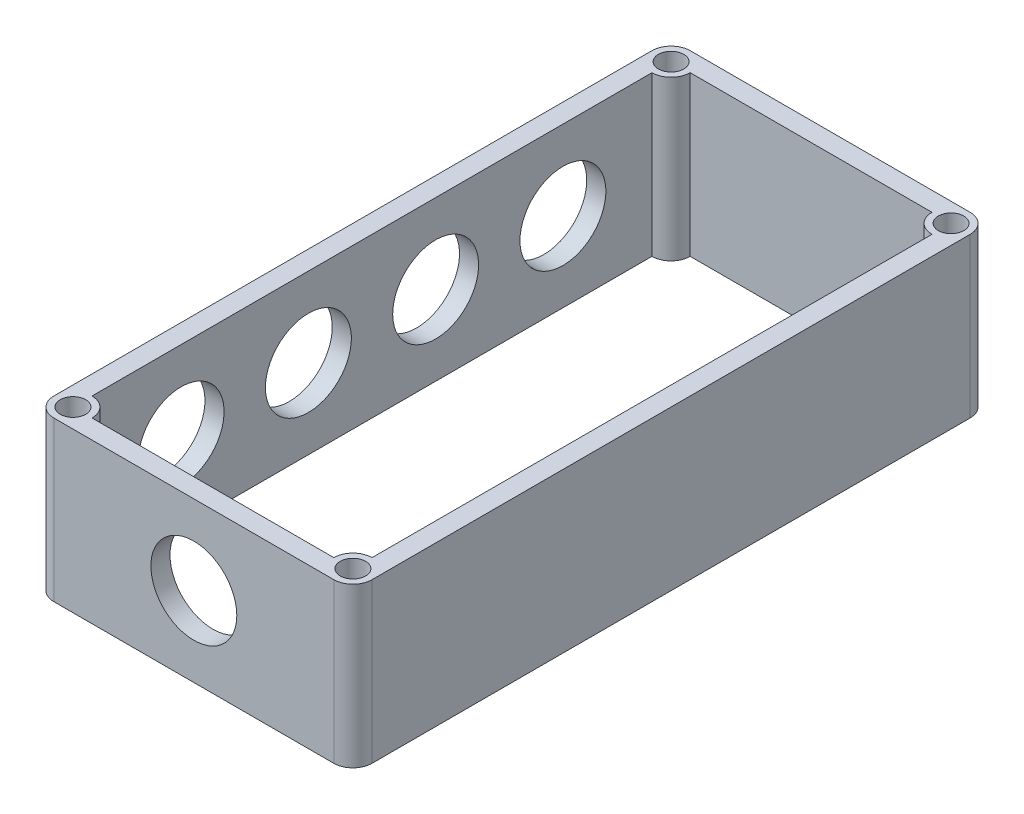
ISO-10303-21;
HEADER;
FILE_DESCRIPTION(('STEP AP214'),'2;1');
FILE_NAME('part.step','',(''),(''),'','','');
FILE_SCHEMA(('AUTOMOTIVE_DESIGN { 1 0 10303 214 1 1 1 1 }'));
ENDSEC;
DATA;
#1=APPLICATION_CONTEXT('core data for automotive mechanical design processes');
#2=APPLICATION_PROTOCOL_DEFINITION('international standard','automotive_design',2000,#1);
#3=PRODUCT_CONTEXT('',#1,'mechanical');
#4=PRODUCT('Part','Part','',(#3));
#5=PRODUCT_RELATED_PRODUCT_CATEGORY('part','',(#4));
#6=PRODUCT_DEFINITION_FORMATION('','',#4);
#7=PRODUCT_DEFINITION_CONTEXT('part definition',#1,'design');
#8=PRODUCT_DEFINITION('design','',#6,#7);
#9=PRODUCT_DEFINITION_SHAPE('','',#8);
#10=(LENGTH_UNIT() NAMED_UNIT(*) SI_UNIT(.MILLI.,.METRE.));
#11=(NAMED_UNIT(*) PLANE_ANGLE_UNIT() SI_UNIT($,.RADIAN.));
#12=(NAMED_UNIT(*) SI_UNIT($,.STERADIAN.) SOLID_ANGLE_UNIT());
#13=UNCERTAINTY_MEASURE_WITH_UNIT(LENGTH_MEASURE(1.E-05),#10,'distance_accuracy_value','');
#14=(GEOMETRIC_REPRESENTATION_CONTEXT(3) GLOBAL_UNCERTAINTY_ASSIGNED_CONTEXT((#13)) GLOBAL_UNIT_ASSIGNED_CONTEXT((#10,
#11,#12)) REPRESENTATION_CONTEXT('',''));
#15=CARTESIAN_POINT('',(0.,0.,0.));
#16=DIRECTION('',(0.,0.,1.));
#17=DIRECTION('',(1.,0.,0.));
#18=AXIS2_PLACEMENT_3D('',#15,#16,#17);
#19=CARTESIAN_POINT('',(22.,25.,0.));
#20=DIRECTION('',(-1.,0.,0.));
#21=DIRECTION('',(0.,0.,1.));
#22=AXIS2_PLACEMENT_3D('',#19,#20,#21);
#23=PLANE('',#22);
#24=DIRECTION('',(0.,0.,-1.));
#25=VECTOR('',#24,1.);
#26=CARTESIAN_POINT('',(22.,0.,0.));
#27=LINE('',#26,#25);
#28=CARTESIAN_POINT('',(22.,0.,44.));
#29=VERTEX_POINT('',#28);
#30=CARTESIAN_POINT('',(22.,0.,-44.));
#31=VERTEX_POINT('',#30);
#32=EDGE_CURVE('E249',#29,#31,#27,.T.);
#33=ORIENTED_EDGE('',*,*,#32,.F.);
#34=DIRECTION('',(0.,-1.,0.));
#35=VECTOR('',#34,1.);
#36=CARTESIAN_POINT('',(22.,25.,44.));
#37=LINE('',#36,#35);
#38=CARTESIAN_POINT('',(22.,25.,44.));
#39=VERTEX_POINT('',#38);
#40=EDGE_CURVE('E11',#39,#29,#37,.T.);
#41=ORIENTED_EDGE('',*,*,#40,.F.);
#42=DIRECTION('',(0.,0.,-1.));
#43=VECTOR('',#42,1.);
#44=CARTESIAN_POINT('',(22.,25.,0.));
#45=LINE('',#44,#43);
#46=CARTESIAN_POINT('',(22.,25.,-44.));
#47=VERTEX_POINT('',#46);
#48=EDGE_CURVE('E293',#39,#47,#45,.T.);
#49=ORIENTED_EDGE('',*,*,#48,.T.);
#50=DIRECTION('',(0.,-1.,0.));
#51=VECTOR('',#50,1.);
#52=CARTESIAN_POINT('',(22.,25.,-44.));
#53=LINE('',#52,#51);
#54=EDGE_CURVE('E118',#47,#31,#53,.T.);
#55=ORIENTED_EDGE('',*,*,#54,.T.);
#56=EDGE_LOOP('',(#33,#41,#49,#55));
#57=FACE_BOUND('',#56,.T.);
#58=ADVANCED_FACE('F41',(#57),#23,.T.);
#59=CARTESIAN_POINT('',(22.,25.,47.));
#60=DIRECTION('',(0.,-1.,0.));
#61=DIRECTION('',(0.,0.,-1.));
#62=AXIS2_PLACEMENT_3D('',#59,#60,#61);
#63=CYLINDRICAL_SURFACE('',#62,3.);
#64=CARTESIAN_POINT('',(22.,0.,47.));
#65=DIRECTION('',(0.,1.,0.));
#66=DIRECTION('',(0.,0.,1.));
#67=AXIS2_PLACEMENT_3D('',#64,#65,#66);
#68=CIRCLE('',#67,3.);
#69=CARTESIAN_POINT('',(19.,0.,47.));
#70=VERTEX_POINT('',#69);
#71=EDGE_CURVE('E246',#29,#70,#68,.T.);
#72=ORIENTED_EDGE('',*,*,#71,.T.);
#73=DIRECTION('',(0.,-1.,0.));
#74=VECTOR('',#73,1.);
#75=CARTESIAN_POINT('',(19.,25.,47.));
#76=LINE('',#75,#74);
#77=CARTESIAN_POINT('',(19.,25.,47.));
#78=VERTEX_POINT('',#77);
#79=EDGE_CURVE('E51',#78,#70,#76,.T.);
#80=ORIENTED_EDGE('',*,*,#79,.F.);
#81=CARTESIAN_POINT('',(22.,25.,47.));
#82=DIRECTION('',(0.,1.,0.));
#83=DIRECTION('',(0.,0.,1.));
#84=AXIS2_PLACEMENT_3D('',#81,#82,#83);
#85=CIRCLE('',#84,3.);
#86=EDGE_CURVE('E291',#39,#78,#85,.T.);
#87=ORIENTED_EDGE('',*,*,#86,.F.);
#88=ORIENTED_EDGE('',*,*,#40,.T.);
#89=EDGE_LOOP('',(#72,#80,#87,#88));
#90=FACE_BOUND('',#89,.T.);
#91=ADVANCED_FACE('F369',(#90),#63,.T.);
#92=CARTESIAN_POINT('',(0.,25.,47.));
#93=DIRECTION('',(0.,0.,-1.));
#94=DIRECTION('',(-1.,0.,0.));
#95=AXIS2_PLACEMENT_3D('',#92,#93,#94);
#96=PLANE('',#95);
#97=CARTESIAN_POINT('',(-3.96810110022986E-12,12.5,47.));
#98=DIRECTION('',(0.,0.,-1.));
#99=DIRECTION('',(-1.,0.,0.));
#100=AXIS2_PLACEMENT_3D('',#97,#98,#99);
#101=CIRCLE('',#100,6.7500000000038);
#102=CARTESIAN_POINT('',(-6.75000000000777,12.5,47.));
#103=VERTEX_POINT('',#102);
#104=EDGE_CURVE('E314',#103,#103,#101,.F.);
#105=ORIENTED_EDGE('',*,*,#104,.T.);
#106=EDGE_LOOP('',(#105));
#107=FACE_BOUND('',#106,.T.);
#108=DIRECTION('',(1.,0.,0.));
#109=VECTOR('',#108,1.);
#110=CARTESIAN_POINT('',(0.,0.,47.));
#111=LINE('',#110,#109);
#112=CARTESIAN_POINT('',(-19.,0.,47.));
#113=VERTEX_POINT('',#112);
#114=EDGE_CURVE('E243',#113,#70,#111,.T.);
#115=ORIENTED_EDGE('',*,*,#114,.F.);
#116=DIRECTION('',(0.,-1.,0.));
#117=VECTOR('',#116,1.);
#118=CARTESIAN_POINT('',(-19.,25.,47.));
#119=LINE('',#118,#117);
#120=CARTESIAN_POINT('',(-19.,25.,47.));
#121=VERTEX_POINT('',#120);
#122=EDGE_CURVE('E196',#121,#113,#119,.T.);
#123=ORIENTED_EDGE('',*,*,#122,.F.);
#124=DIRECTION('',(1.,0.,0.));
#125=VECTOR('',#124,1.);
#126=CARTESIAN_POINT('',(0.,25.,47.));
#127=LINE('',#126,#125);
#128=EDGE_CURVE('E288',#121,#78,#127,.T.);
#129=ORIENTED_EDGE('',*,*,#128,.T.);
#130=ORIENTED_EDGE('',*,*,#79,.T.);
#131=EDGE_LOOP('',(#115,#123,#129,#130));
#132=FACE_BOUND('',#131,.T.);
#133=ADVANCED_FACE('F363',(#107,#132),#96,.T.);
#134=CARTESIAN_POINT('',(-22.,25.,47.));
#135=DIRECTION('',(0.,-1.,0.));
#136=DIRECTION('',(0.,0.,-1.));
#137=AXIS2_PLACEMENT_3D('',#134,#135,#136);
#138=CYLINDRICAL_SURFACE('',#137,3.);
#139=CARTESIAN_POINT('',(-22.,0.,47.));
#140=DIRECTION('',(0.,1.,0.));
#141=DIRECTION('',(0.,0.,1.));
#142=AXIS2_PLACEMENT_3D('',#139,#140,#141);
#143=CIRCLE('',#142,3.);
#144=CARTESIAN_POINT('',(-22.,0.,44.));
#145=VERTEX_POINT('',#144);
#146=EDGE_CURVE('E240',#113,#145,#143,.T.);
#147=ORIENTED_EDGE('',*,*,#146,.T.);
#148=DIRECTION('',(0.,-1.,0.));
#149=VECTOR('',#148,1.);
#150=CARTESIAN_POINT('',(-22.,25.,44.));
#151=LINE('',#150,#149);
#152=CARTESIAN_POINT('',(-22.,25.,44.));
#153=VERTEX_POINT('',#152);
#154=EDGE_CURVE('E189',#153,#145,#151,.T.);
#155=ORIENTED_EDGE('',*,*,#154,.F.);
#156=CARTESIAN_POINT('',(-22.,25.,47.));
#157=DIRECTION('',(0.,1.,0.));
#158=DIRECTION('',(0.,0.,1.));
#159=AXIS2_PLACEMENT_3D('',#156,#157,#158);
#160=CIRCLE('',#159,3.);
#161=EDGE_CURVE('E286',#121,#153,#160,.T.);
#162=ORIENTED_EDGE('',*,*,#161,.F.);
#163=ORIENTED_EDGE('',*,*,#122,.T.);
#164=EDGE_LOOP('',(#147,#155,#162,#163));
#165=FACE_BOUND('',#164,.T.);
#166=ADVANCED_FACE('F347',(#165),#138,.T.);
#167=CARTESIAN_POINT('',(-22.,25.,0.));
#168=DIRECTION('',(-1.,0.,0.));
#169=DIRECTION('',(0.,0.,1.));
#170=AXIS2_PLACEMENT_3D('',#167,#168,#169);
#171=PLANE('',#170);
#172=CARTESIAN_POINT('',(-22.,12.5,-30.));
#173=DIRECTION('',(-1.,0.,0.));
#174=DIRECTION('',(0.,0.,1.));
#175=AXIS2_PLACEMENT_3D('',#172,#173,#174);
#176=CIRCLE('',#175,6.75);
#177=CARTESIAN_POINT('',(-22.,12.5,-23.25));
#178=VERTEX_POINT('',#177);
#179=EDGE_CURVE('E317',#178,#178,#176,.F.);
#180=ORIENTED_EDGE('',*,*,#179,.F.);
#181=EDGE_LOOP('',(#180));
#182=FACE_BOUND('',#181,.T.);
#183=CARTESIAN_POINT('',(-22.,12.5,-10.));
#184=DIRECTION('',(-1.,0.,0.));
#185=DIRECTION('',(0.,0.,1.));
#186=AXIS2_PLACEMENT_3D('',#183,#184,#185);
#187=CIRCLE('',#186,6.75);
#188=CARTESIAN_POINT('',(-22.,12.5,-3.25));
#189=VERTEX_POINT('',#188);
#190=EDGE_CURVE('E330',#189,#189,#187,.F.);
#191=ORIENTED_EDGE('',*,*,#190,.F.);
#192=EDGE_LOOP('',(#191));
#193=FACE_BOUND('',#192,.T.);
#194=CARTESIAN_POINT('',(-22.,12.5,10.));
#195=DIRECTION('',(-1.,0.,0.));
#196=DIRECTION('',(0.,0.,1.));
#197=AXIS2_PLACEMENT_3D('',#194,#195,#196);
#198=CIRCLE('',#197,6.75);
#199=CARTESIAN_POINT('',(-22.,12.5,16.75));
#200=VERTEX_POINT('',#199);
#201=EDGE_CURVE('E324',#200,#200,#198,.F.);
#202=ORIENTED_EDGE('',*,*,#201,.F.);
#203=EDGE_LOOP('',(#202));
#204=FACE_BOUND('',#203,.T.);
#205=CARTESIAN_POINT('',(-22.,12.5,30.));
#206=DIRECTION('',(-1.,0.,0.));
#207=DIRECTION('',(0.,0.,1.));
#208=AXIS2_PLACEMENT_3D('',#205,#206,#207);
#209=CIRCLE('',#208,6.75);
#210=CARTESIAN_POINT('',(-22.,12.5,36.75));
#211=VERTEX_POINT('',#210);
#212=EDGE_CURVE('E318',#211,#211,#209,.F.);
#213=ORIENTED_EDGE('',*,*,#212,.F.);
#214=EDGE_LOOP('',(#213));
#215=FACE_BOUND('',#214,.T.);
#216=DIRECTION('',(0.,0.,-1.));
#217=VECTOR('',#216,1.);
#218=CARTESIAN_POINT('',(-22.,0.,0.));
#219=LINE('',#218,#217);
#220=CARTESIAN_POINT('',(-22.,0.,-44.));
#221=VERTEX_POINT('',#220);
#222=EDGE_CURVE('E237',#145,#221,#219,.T.);
#223=ORIENTED_EDGE('',*,*,#222,.T.);
#224=DIRECTION('',(0.,-1.,0.));
#225=VECTOR('',#224,1.);
#226=CARTESIAN_POINT('',(-22.,25.,-44.));
#227=LINE('',#226,#225);
#228=CARTESIAN_POINT('',(-22.,25.,-44.));
#229=VERTEX_POINT('',#228);
#230=EDGE_CURVE('E187',#229,#221,#227,.T.);
#231=ORIENTED_EDGE('',*,*,#230,.F.);
#232=DIRECTION('',(0.,0.,-1.));
#233=VECTOR('',#232,1.);
#234=CARTESIAN_POINT('',(-22.,25.,0.));
#235=LINE('',#234,#233);
#236=EDGE_CURVE('E180',#153,#229,#235,.T.);
#237=ORIENTED_EDGE('',*,*,#236,.F.);
#238=ORIENTED_EDGE('',*,*,#154,.T.);
#239=EDGE_LOOP('',(#223,#231,#237,#238));
#240=FACE_BOUND('',#239,.T.);
#241=ADVANCED_FACE('F344',(#182,#193,#204,#215,#240),#171,.F.);
#242=CARTESIAN_POINT('',(-22.,25.,-47.));
#243=DIRECTION('',(0.,-1.,0.));
#244=DIRECTION('',(0.,0.,-1.));
#245=AXIS2_PLACEMENT_3D('',#242,#243,#244);
#246=CYLINDRICAL_SURFACE('',#245,3.);
#247=CARTESIAN_POINT('',(-22.,0.,-47.));
#248=DIRECTION('',(0.,1.,0.));
#249=DIRECTION('',(0.,0.,1.));
#250=AXIS2_PLACEMENT_3D('',#247,#248,#249);
#251=CIRCLE('',#250,3.);
#252=CARTESIAN_POINT('',(-19.,0.,-47.));
#253=VERTEX_POINT('',#252);
#254=EDGE_CURVE('E186',#221,#253,#251,.T.);
#255=ORIENTED_EDGE('',*,*,#254,.T.);
#256=DIRECTION('',(0.,-1.,0.));
#257=VECTOR('',#256,1.);
#258=CARTESIAN_POINT('',(-19.,25.,-47.));
#259=LINE('',#258,#257);
#260=CARTESIAN_POINT('',(-19.,25.,-47.));
#261=VERTEX_POINT('',#260);
#262=EDGE_CURVE('E171',#261,#253,#259,.T.);
#263=ORIENTED_EDGE('',*,*,#262,.F.);
#264=CARTESIAN_POINT('',(-22.,25.,-47.));
#265=DIRECTION('',(0.,1.,0.));
#266=DIRECTION('',(0.,0.,1.));
#267=AXIS2_PLACEMENT_3D('',#264,#265,#266);
#268=CIRCLE('',#267,3.);
#269=EDGE_CURVE('E174',#229,#261,#268,.T.);
#270=ORIENTED_EDGE('',*,*,#269,.F.);
#271=ORIENTED_EDGE('',*,*,#230,.T.);
#272=EDGE_LOOP('',(#255,#263,#270,#271));
#273=FACE_BOUND('',#272,.T.);
#274=ADVANCED_FACE('F185',(#273),#246,.T.);
#275=CARTESIAN_POINT('',(0.,25.,-47.));
#276=DIRECTION('',(0.,0.,-1.));
#277=DIRECTION('',(-1.,0.,0.));
#278=AXIS2_PLACEMENT_3D('',#275,#276,#277);
#279=PLANE('',#278);
#280=DIRECTION('',(1.,0.,0.));
#281=VECTOR('',#280,1.);
#282=CARTESIAN_POINT('',(0.,0.,-47.));
#283=LINE('',#282,#281);
#284=CARTESIAN_POINT('',(19.,0.,-47.));
#285=VERTEX_POINT('',#284);
#286=EDGE_CURVE('E234',#253,#285,#283,.T.);
#287=ORIENTED_EDGE('',*,*,#286,.T.);
#288=DIRECTION('',(0.,-1.,0.));
#289=VECTOR('',#288,1.);
#290=CARTESIAN_POINT('',(19.,25.,-47.));
#291=LINE('',#290,#289);
#292=CARTESIAN_POINT('',(19.,25.,-47.));
#293=VERTEX_POINT('',#292);
#294=EDGE_CURVE('E173',#293,#285,#291,.T.);
#295=ORIENTED_EDGE('',*,*,#294,.F.);
#296=DIRECTION('',(1.,0.,0.));
#297=VECTOR('',#296,1.);
#298=CARTESIAN_POINT('',(0.,25.,-47.));
#299=LINE('',#298,#297);
#300=EDGE_CURVE('E166',#261,#293,#299,.T.);
#301=ORIENTED_EDGE('',*,*,#300,.F.);
#302=ORIENTED_EDGE('',*,*,#262,.T.);
#303=EDGE_LOOP('',(#287,#295,#301,#302));
#304=FACE_BOUND('',#303,.T.);
#305=ADVANCED_FACE('F169',(#304),#279,.F.);
#306=CARTESIAN_POINT('',(0.,25.,50.));
#307=DIRECTION('',(0.,0.,-1.));
#308=DIRECTION('',(-1.,0.,0.));
#309=AXIS2_PLACEMENT_3D('',#306,#307,#308);
#310=PLANE('',#309);
#311=CARTESIAN_POINT('',(-3.96810110022986E-12,12.5,50.));
#312=DIRECTION('',(0.,0.,1.));
#313=DIRECTION('',(1.,0.,0.));
#314=AXIS2_PLACEMENT_3D('',#311,#312,#313);
#315=CIRCLE('',#314,6.7500000000038);
#316=CARTESIAN_POINT('',(6.74999999999983,12.5,50.));
#317=VERTEX_POINT('',#316);
#318=EDGE_CURVE('E272',#317,#317,#315,.T.);
#319=ORIENTED_EDGE('',*,*,#318,.F.);
#320=EDGE_LOOP('',(#319));
#321=FACE_BOUND('',#320,.T.);
#322=DIRECTION('',(1.,0.,0.));
#323=VECTOR('',#322,1.);
#324=CARTESIAN_POINT('',(0.,0.,50.));
#325=LINE('',#324,#323);
#326=CARTESIAN_POINT('',(-22.,0.,50.));
#327=VERTEX_POINT('',#326);
#328=CARTESIAN_POINT('',(22.,0.,50.));
#329=VERTEX_POINT('',#328);
#330=EDGE_CURVE('E270',#327,#329,#325,.T.);
#331=ORIENTED_EDGE('',*,*,#330,.T.);
#332=DIRECTION('',(0.,-1.,0.));
#333=VECTOR('',#332,1.);
#334=CARTESIAN_POINT('',(22.,25.,50.));
#335=LINE('',#334,#333);
#336=CARTESIAN_POINT('',(22.,25.,50.));
#337=VERTEX_POINT('',#336);
#338=EDGE_CURVE('E45',#337,#329,#335,.T.);
#339=ORIENTED_EDGE('',*,*,#338,.F.);
#340=DIRECTION('',(1.,0.,0.));
#341=VECTOR('',#340,1.);
#342=CARTESIAN_POINT('',(0.,25.,50.));
#343=LINE('',#342,#341);
#344=CARTESIAN_POINT('',(-22.,25.,50.));
#345=VERTEX_POINT('',#344);
#346=EDGE_CURVE('E223',#345,#337,#343,.T.);
#347=ORIENTED_EDGE('',*,*,#346,.F.);
#348=DIRECTION('',(0.,-1.,0.));
#349=VECTOR('',#348,1.);
#350=CARTESIAN_POINT('',(-22.,25.,50.));
#351=LINE('',#350,#349);
#352=EDGE_CURVE('E199',#345,#327,#351,.T.);
#353=ORIENTED_EDGE('',*,*,#352,.T.);
#354=EDGE_LOOP('',(#331,#339,#347,#353));
#355=FACE_BOUND('',#354,.T.);
#356=ADVANCED_FACE('F43',(#321,#355),#310,.F.);
#357=CARTESIAN_POINT('',(22.,25.,47.));
#358=DIRECTION('',(0.,-1.,0.));
#359=DIRECTION('',(0.,0.,-1.));
#360=AXIS2_PLACEMENT_3D('',#357,#358,#359);
#361=CYLINDRICAL_SURFACE('',#360,3.00000000000001);
#362=CARTESIAN_POINT('',(22.,0.,47.));
#363=DIRECTION('',(0.,1.,0.));
#364=DIRECTION('',(0.,0.,1.));
#365=AXIS2_PLACEMENT_3D('',#362,#363,#364);
#366=CIRCLE('',#365,3.00000000000001);
#367=CARTESIAN_POINT('',(25.,0.,47.));
#368=VERTEX_POINT('',#367);
#369=EDGE_CURVE('E268',#329,#368,#366,.T.);
#370=ORIENTED_EDGE('',*,*,#369,.T.);
#371=DIRECTION('',(0.,-1.,0.));
#372=VECTOR('',#371,1.);
#373=CARTESIAN_POINT('',(25.,25.,47.));
#374=LINE('',#373,#372);
#375=CARTESIAN_POINT('',(25.,25.,47.));
#376=VERTEX_POINT('',#375);
#377=EDGE_CURVE('E212',#376,#368,#374,.T.);
#378=ORIENTED_EDGE('',*,*,#377,.F.);
#379=CARTESIAN_POINT('',(22.,25.,47.));
#380=DIRECTION('',(0.,1.,0.));
#381=DIRECTION('',(0.,0.,1.));
#382=AXIS2_PLACEMENT_3D('',#379,#380,#381);
#383=CIRCLE('',#382,3.00000000000001);
#384=EDGE_CURVE('E126',#337,#376,#383,.T.);
#385=ORIENTED_EDGE('',*,*,#384,.F.);
#386=ORIENTED_EDGE('',*,*,#338,.T.);
#387=EDGE_LOOP('',(#370,#378,#385,#386));
#388=FACE_BOUND('',#387,.T.);
#389=ADVANCED_FACE('F410',(#388),#361,.T.);
#390=CARTESIAN_POINT('',(25.,25.,0.));
#391=DIRECTION('',(-1.,0.,0.));
#392=DIRECTION('',(0.,0.,1.));
#393=AXIS2_PLACEMENT_3D('',#390,#391,#392);
#394=PLANE('',#393);
#395=DIRECTION('',(0.,0.,-1.));
#396=VECTOR('',#395,1.);
#397=CARTESIAN_POINT('',(25.,0.,0.));
#398=LINE('',#397,#396);
#399=CARTESIAN_POINT('',(25.,0.,-47.));
#400=VERTEX_POINT('',#399);
#401=EDGE_CURVE('E266',#368,#400,#398,.T.);
#402=ORIENTED_EDGE('',*,*,#401,.T.);
#403=DIRECTION('',(0.,-1.,0.));
#404=VECTOR('',#403,1.);
#405=CARTESIAN_POINT('',(25.,25.,-47.));
#406=LINE('',#405,#404);
#407=CARTESIAN_POINT('',(25.,25.,-47.));
#408=VERTEX_POINT('',#407);
#409=EDGE_CURVE('E210',#408,#400,#406,.T.);
#410=ORIENTED_EDGE('',*,*,#409,.F.);
#411=DIRECTION('',(0.,0.,-1.));
#412=VECTOR('',#411,1.);
#413=CARTESIAN_POINT('',(25.,25.,0.));
#414=LINE('',#413,#412);
#415=EDGE_CURVE('E308',#376,#408,#414,.T.);
#416=ORIENTED_EDGE('',*,*,#415,.F.);
#417=ORIENTED_EDGE('',*,*,#377,.T.);
#418=EDGE_LOOP('',(#402,#410,#416,#417));
#419=FACE_BOUND('',#418,.T.);
#420=ADVANCED_FACE('F407',(#419),#394,.F.);
#421=CARTESIAN_POINT('',(22.,25.,-47.));
#422=DIRECTION('',(0.,-1.,0.));
#423=DIRECTION('',(0.,0.,-1.));
#424=AXIS2_PLACEMENT_3D('',#421,#422,#423);
#425=CYLINDRICAL_SURFACE('',#424,3.);
#426=CARTESIAN_POINT('',(22.,0.,-47.));
#427=DIRECTION('',(0.,1.,0.));
#428=DIRECTION('',(0.,0.,1.));
#429=AXIS2_PLACEMENT_3D('',#426,#427,#428);
#430=CIRCLE('',#429,3.);
#431=CARTESIAN_POINT('',(22.,0.,-50.));
#432=VERTEX_POINT('',#431);
#433=EDGE_CURVE('E263',#400,#432,#430,.T.);
#434=ORIENTED_EDGE('',*,*,#433,.T.);
#435=DIRECTION('',(0.,-1.,0.));
#436=VECTOR('',#435,1.);
#437=CARTESIAN_POINT('',(22.,25.,-50.));
#438=LINE('',#437,#436);
#439=CARTESIAN_POINT('',(22.,25.,-50.));
#440=VERTEX_POINT('',#439);
#441=EDGE_CURVE('E208',#440,#432,#438,.T.);
#442=ORIENTED_EDGE('',*,*,#441,.F.);
#443=CARTESIAN_POINT('',(22.,25.,-47.));
#444=DIRECTION('',(0.,1.,0.));
#445=DIRECTION('',(0.,0.,1.));
#446=AXIS2_PLACEMENT_3D('',#443,#444,#445);
#447=CIRCLE('',#446,3.);
#448=EDGE_CURVE('E306',#408,#440,#447,.T.);
#449=ORIENTED_EDGE('',*,*,#448,.F.);
#450=ORIENTED_EDGE('',*,*,#409,.T.);
#451=EDGE_LOOP('',(#434,#442,#449,#450));
#452=FACE_BOUND('',#451,.T.);
#453=ADVANCED_FACE('F403',(#452),#425,.T.);
#454=CARTESIAN_POINT('',(0.,25.,-50.));
#455=DIRECTION('',(0.,0.,-1.));
#456=DIRECTION('',(-1.,0.,0.));
#457=AXIS2_PLACEMENT_3D('',#454,#455,#456);
#458=PLANE('',#457);
#459=DIRECTION('',(1.,0.,0.));
#460=VECTOR('',#459,1.);
#461=CARTESIAN_POINT('',(0.,0.,-50.));
#462=LINE('',#461,#460);
#463=CARTESIAN_POINT('',(-22.,0.,-50.));
#464=VERTEX_POINT('',#463);
#465=EDGE_CURVE('E260',#464,#432,#462,.T.);
#466=ORIENTED_EDGE('',*,*,#465,.F.);
#467=DIRECTION('',(0.,-1.,0.));
#468=VECTOR('',#467,1.);
#469=CARTESIAN_POINT('',(-22.,25.,-50.));
#470=LINE('',#469,#468);
#471=CARTESIAN_POINT('',(-22.,25.,-50.));
#472=VERTEX_POINT('',#471);
#473=EDGE_CURVE('E206',#472,#464,#470,.T.);
#474=ORIENTED_EDGE('',*,*,#473,.F.);
#475=DIRECTION('',(1.,0.,0.));
#476=VECTOR('',#475,1.);
#477=CARTESIAN_POINT('',(0.,25.,-50.));
#478=LINE('',#477,#476);
#479=EDGE_CURVE('E303',#472,#440,#478,.T.);
#480=ORIENTED_EDGE('',*,*,#479,.T.);
#481=ORIENTED_EDGE('',*,*,#441,.T.);
#482=EDGE_LOOP('',(#466,#474,#480,#481));
#483=FACE_BOUND('',#482,.T.);
#484=ADVANCED_FACE('F399',(#483),#458,.T.);
#485=CARTESIAN_POINT('',(-22.,25.,-47.));
#486=DIRECTION('',(0.,-1.,0.));
#487=DIRECTION('',(0.,0.,-1.));
#488=AXIS2_PLACEMENT_3D('',#485,#486,#487);
#489=CYLINDRICAL_SURFACE('',#488,3.);
#490=CARTESIAN_POINT('',(-22.,0.,-47.));
#491=DIRECTION('',(0.,1.,0.));
#492=DIRECTION('',(0.,0.,1.));
#493=AXIS2_PLACEMENT_3D('',#490,#491,#492);
#494=CIRCLE('',#493,3.);
#495=CARTESIAN_POINT('',(-25.,0.,-47.));
#496=VERTEX_POINT('',#495);
#497=EDGE_CURVE('E257',#464,#496,#494,.T.);
#498=ORIENTED_EDGE('',*,*,#497,.T.);
#499=DIRECTION('',(0.,-1.,0.));
#500=VECTOR('',#499,1.);
#501=CARTESIAN_POINT('',(-25.,25.,-47.));
#502=LINE('',#501,#500);
#503=CARTESIAN_POINT('',(-25.,25.,-47.));
#504=VERTEX_POINT('',#503);
#505=EDGE_CURVE('E204',#504,#496,#502,.T.);
#506=ORIENTED_EDGE('',*,*,#505,.F.);
#507=CARTESIAN_POINT('',(-22.,25.,-47.));
#508=DIRECTION('',(0.,1.,0.));
#509=DIRECTION('',(0.,0.,1.));
#510=AXIS2_PLACEMENT_3D('',#507,#508,#509);
#511=CIRCLE('',#510,3.);
#512=EDGE_CURVE('E301',#472,#504,#511,.T.);
#513=ORIENTED_EDGE('',*,*,#512,.F.);
#514=ORIENTED_EDGE('',*,*,#473,.T.);
#515=EDGE_LOOP('',(#498,#506,#513,#514));
#516=FACE_BOUND('',#515,.T.);
#517=ADVANCED_FACE('F395',(#516),#489,.T.);
#518=CARTESIAN_POINT('',(-25.,25.,0.));
#519=DIRECTION('',(-1.,0.,0.));
#520=DIRECTION('',(0.,0.,1.));
#521=AXIS2_PLACEMENT_3D('',#518,#519,#520);
#522=PLANE('',#521);
#523=CARTESIAN_POINT('',(-25.,12.5,-30.));
#524=DIRECTION('',(-1.,0.,0.));
#525=DIRECTION('',(0.,0.,1.));
#526=AXIS2_PLACEMENT_3D('',#523,#524,#525);
#527=CIRCLE('',#526,6.75);
#528=CARTESIAN_POINT('',(-25.,12.5,-23.25));
#529=VERTEX_POINT('',#528);
#530=EDGE_CURVE('E336',#529,#529,#527,.T.);
#531=ORIENTED_EDGE('',*,*,#530,.F.);
#532=EDGE_LOOP('',(#531));
#533=FACE_BOUND('',#532,.T.);
#534=CARTESIAN_POINT('',(-25.,12.5,-10.));
#535=DIRECTION('',(-1.,0.,0.));
#536=DIRECTION('',(0.,0.,1.));
#537=AXIS2_PLACEMENT_3D('',#534,#535,#536);
#538=CIRCLE('',#537,6.75);
#539=CARTESIAN_POINT('',(-25.,12.5,-3.25));
#540=VERTEX_POINT('',#539);
#541=EDGE_CURVE('E333',#540,#540,#538,.T.);
#542=ORIENTED_EDGE('',*,*,#541,.F.);
#543=EDGE_LOOP('',(#542));
#544=FACE_BOUND('',#543,.T.);
#545=CARTESIAN_POINT('',(-25.,12.5,10.));
#546=DIRECTION('',(-1.,0.,0.));
#547=DIRECTION('',(0.,0.,-1.));
#548=AXIS2_PLACEMENT_3D('',#545,#546,#547);
#549=CIRCLE('',#548,6.75);
#550=CARTESIAN_POINT('',(-25.,12.5,3.25));
#551=VERTEX_POINT('',#550);
#552=EDGE_CURVE('E327',#551,#551,#549,.T.);
#553=ORIENTED_EDGE('',*,*,#552,.F.);
#554=EDGE_LOOP('',(#553));
#555=FACE_BOUND('',#554,.T.);
#556=CARTESIAN_POINT('',(-25.,12.5,30.));
#557=DIRECTION('',(-1.,0.,0.));
#558=DIRECTION('',(0.,0.,-1.));
#559=AXIS2_PLACEMENT_3D('',#556,#557,#558);
#560=CIRCLE('',#559,6.75);
#561=CARTESIAN_POINT('',(-25.,12.5,23.25));
#562=VERTEX_POINT('',#561);
#563=EDGE_CURVE('E321',#562,#562,#560,.T.);
#564=ORIENTED_EDGE('',*,*,#563,.F.);
#565=EDGE_LOOP('',(#564));
#566=FACE_BOUND('',#565,.T.);
#567=DIRECTION('',(0.,0.,-1.));
#568=VECTOR('',#567,1.);
#569=CARTESIAN_POINT('',(-25.,0.,0.));
#570=LINE('',#569,#568);
#571=CARTESIAN_POINT('',(-25.,0.,47.));
#572=VERTEX_POINT('',#571);
#573=EDGE_CURVE('E254',#572,#496,#570,.T.);
#574=ORIENTED_EDGE('',*,*,#573,.F.);
#575=DIRECTION('',(0.,-1.,0.));
#576=VECTOR('',#575,1.);
#577=CARTESIAN_POINT('',(-25.,25.,47.));
#578=LINE('',#577,#576);
#579=CARTESIAN_POINT('',(-25.,25.,47.));
#580=VERTEX_POINT('',#579);
#581=EDGE_CURVE('E201',#580,#572,#578,.T.);
#582=ORIENTED_EDGE('',*,*,#581,.F.);
#583=DIRECTION('',(0.,0.,-1.));
#584=VECTOR('',#583,1.);
#585=CARTESIAN_POINT('',(-25.,25.,0.));
#586=LINE('',#585,#584);
#587=EDGE_CURVE('E298',#580,#504,#586,.T.);
#588=ORIENTED_EDGE('',*,*,#587,.T.);
#589=ORIENTED_EDGE('',*,*,#505,.T.);
#590=EDGE_LOOP('',(#574,#582,#588,#589));
#591=FACE_BOUND('',#590,.T.);
#592=ADVANCED_FACE('F391',(#533,#544,#555,#566,#591),#522,.T.);
#593=CARTESIAN_POINT('',(-22.,25.,47.));
#594=DIRECTION('',(0.,-1.,0.));
#595=DIRECTION('',(0.,0.,-1.));
#596=AXIS2_PLACEMENT_3D('',#593,#594,#595);
#597=CYLINDRICAL_SURFACE('',#596,2.00000000000001);
#598=CARTESIAN_POINT('',(-22.,25.,47.));
#599=DIRECTION('',(0.,1.,0.));
#600=DIRECTION('',(0.,0.,1.));
#601=AXIS2_PLACEMENT_3D('',#598,#599,#600);
#602=CIRCLE('',#601,2.00000000000001);
#603=CARTESIAN_POINT('',(-22.,25.,49.));
#604=VERTEX_POINT('',#603);
#605=EDGE_CURVE('E275',#604,#604,#602,.T.);
#606=ORIENTED_EDGE('',*,*,#605,.T.);
#607=EDGE_LOOP('',(#606));
#608=FACE_BOUND('',#607,.T.);
#609=CARTESIAN_POINT('',(-22.,0.,47.));
#610=DIRECTION('',(0.,1.,0.));
#611=DIRECTION('',(0.,0.,1.));
#612=AXIS2_PLACEMENT_3D('',#609,#610,#611);
#613=CIRCLE('',#612,2.00000000000001);
#614=CARTESIAN_POINT('',(-22.,0.,49.));
#615=VERTEX_POINT('',#614);
#616=EDGE_CURVE('E224',#615,#615,#613,.T.);
#617=ORIENTED_EDGE('',*,*,#616,.F.);
#618=EDGE_LOOP('',(#617));
#619=FACE_BOUND('',#618,.T.);
#620=ADVANCED_FACE('F394',(#608,#619),#597,.F.);
#621=CARTESIAN_POINT('',(22.,25.,-47.));
#622=DIRECTION('',(0.,-1.,0.));
#623=DIRECTION('',(0.,0.,-1.));
#624=AXIS2_PLACEMENT_3D('',#621,#622,#623);
#625=CYLINDRICAL_SURFACE('',#624,2.00000000000001);
#626=CARTESIAN_POINT('',(22.,25.,-47.));
#627=DIRECTION('',(0.,1.,0.));
#628=DIRECTION('',(0.,0.,1.));
#629=AXIS2_PLACEMENT_3D('',#626,#627,#628);
#630=CIRCLE('',#629,2.00000000000001);
#631=CARTESIAN_POINT('',(22.,25.,-45.));
#632=VERTEX_POINT('',#631);
#633=EDGE_CURVE('E278',#632,#632,#630,.T.);
#634=ORIENTED_EDGE('',*,*,#633,.T.);
#635=EDGE_LOOP('',(#634));
#636=FACE_BOUND('',#635,.T.);
#637=CARTESIAN_POINT('',(22.,0.,-47.));
#638=DIRECTION('',(0.,1.,0.));
#639=DIRECTION('',(0.,0.,1.));
#640=AXIS2_PLACEMENT_3D('',#637,#638,#639);
#641=CIRCLE('',#640,2.00000000000001);
#642=CARTESIAN_POINT('',(22.,0.,-45.));
#643=VERTEX_POINT('',#642);
#644=EDGE_CURVE('E227',#643,#643,#641,.T.);
#645=ORIENTED_EDGE('',*,*,#644,.F.);
#646=EDGE_LOOP('',(#645));
#647=FACE_BOUND('',#646,.T.);
#648=ADVANCED_FACE('F451',(#636,#647),#625,.F.);
#649=CARTESIAN_POINT('',(22.,25.,47.));
#650=DIRECTION('',(0.,-1.,0.));
#651=DIRECTION('',(0.,0.,-1.));
#652=AXIS2_PLACEMENT_3D('',#649,#650,#651);
#653=CYLINDRICAL_SURFACE('',#652,2.00000000000001);
#654=CARTESIAN_POINT('',(22.,25.,47.));
#655=DIRECTION('',(0.,1.,0.));
#656=DIRECTION('',(0.,0.,1.));
#657=AXIS2_PLACEMENT_3D('',#654,#655,#656);
#658=CIRCLE('',#657,2.00000000000001);
#659=CARTESIAN_POINT('',(22.,25.,49.));
#660=VERTEX_POINT('',#659);
#661=EDGE_CURVE('E281',#660,#660,#658,.T.);
#662=ORIENTED_EDGE('',*,*,#661,.T.);
#663=EDGE_LOOP('',(#662));
#664=FACE_BOUND('',#663,.T.);
#665=CARTESIAN_POINT('',(22.,0.,47.));
#666=DIRECTION('',(0.,1.,0.));
#667=DIRECTION('',(0.,0.,1.));
#668=AXIS2_PLACEMENT_3D('',#665,#666,#667);
#669=CIRCLE('',#668,2.00000000000001);
#670=CARTESIAN_POINT('',(22.,0.,49.));
#671=VERTEX_POINT('',#670);
#672=EDGE_CURVE('E230',#671,#671,#669,.T.);
#673=ORIENTED_EDGE('',*,*,#672,.F.);
#674=EDGE_LOOP('',(#673));
#675=FACE_BOUND('',#674,.T.);
#676=ADVANCED_FACE('F455',(#664,#675),#653,.F.);
#677=CARTESIAN_POINT('',(22.,25.,-47.));
#678=DIRECTION('',(0.,-1.,0.));
#679=DIRECTION('',(0.,0.,-1.));
#680=AXIS2_PLACEMENT_3D('',#677,#678,#679);
#681=CYLINDRICAL_SURFACE('',#680,3.);
#682=CARTESIAN_POINT('',(22.,0.,-47.));
#683=DIRECTION('',(0.,1.,0.));
#684=DIRECTION('',(0.,0.,1.));
#685=AXIS2_PLACEMENT_3D('',#682,#683,#684);
#686=CIRCLE('',#685,3.);
#687=EDGE_CURVE('E111',#285,#31,#686,.T.);
#688=ORIENTED_EDGE('',*,*,#687,.T.);
#689=ORIENTED_EDGE('',*,*,#54,.F.);
#690=CARTESIAN_POINT('',(22.,25.,-47.));
#691=DIRECTION('',(0.,1.,0.));
#692=DIRECTION('',(0.,0.,1.));
#693=AXIS2_PLACEMENT_3D('',#690,#691,#692);
#694=CIRCLE('',#693,3.);
#695=EDGE_CURVE('E60',#293,#47,#694,.T.);
#696=ORIENTED_EDGE('',*,*,#695,.F.);
#697=ORIENTED_EDGE('',*,*,#294,.T.);
#698=EDGE_LOOP('',(#688,#689,#696,#697));
#699=FACE_BOUND('',#698,.T.);
#700=ADVANCED_FACE('F389',(#699),#681,.T.);
#701=CARTESIAN_POINT('',(-22.,25.,47.));
#702=DIRECTION('',(0.,-1.,0.));
#703=DIRECTION('',(0.,0.,-1.));
#704=AXIS2_PLACEMENT_3D('',#701,#702,#703);
#705=CYLINDRICAL_SURFACE('',#704,3.00000000000001);
#706=CARTESIAN_POINT('',(-22.,0.,47.));
#707=DIRECTION('',(0.,1.,0.));
#708=DIRECTION('',(0.,0.,1.));
#709=AXIS2_PLACEMENT_3D('',#706,#707,#708);
#710=CIRCLE('',#709,3.00000000000001);
#711=EDGE_CURVE('E251',#327,#572,#710,.F.);
#712=ORIENTED_EDGE('',*,*,#711,.F.);
#713=ORIENTED_EDGE('',*,*,#352,.F.);
#714=CARTESIAN_POINT('',(-22.,25.,47.));
#715=DIRECTION('',(0.,1.,0.));
#716=DIRECTION('',(0.,0.,1.));
#717=AXIS2_PLACEMENT_3D('',#714,#715,#716);
#718=CIRCLE('',#717,3.00000000000001);
#719=EDGE_CURVE('E295',#345,#580,#718,.F.);
#720=ORIENTED_EDGE('',*,*,#719,.T.);
#721=ORIENTED_EDGE('',*,*,#581,.T.);
#722=EDGE_LOOP('',(#712,#713,#720,#721));
#723=FACE_BOUND('',#722,.T.);
#724=ADVANCED_FACE('F385',(#723),#705,.T.);
#725=CARTESIAN_POINT('',(-22.,25.,-47.));
#726=DIRECTION('',(0.,-1.,0.));
#727=DIRECTION('',(0.,0.,-1.));
#728=AXIS2_PLACEMENT_3D('',#725,#726,#727);
#729=CYLINDRICAL_SURFACE('',#728,2.00000000000001);
#730=CARTESIAN_POINT('',(-22.,25.,-47.));
#731=DIRECTION('',(0.,1.,0.));
#732=DIRECTION('',(0.,0.,1.));
#733=AXIS2_PLACEMENT_3D('',#730,#731,#732);
#734=CIRCLE('',#733,2.00000000000001);
#735=CARTESIAN_POINT('',(-22.,25.,-45.));
#736=VERTEX_POINT('',#735);
#737=EDGE_CURVE('E202',#736,#736,#734,.T.);
#738=ORIENTED_EDGE('',*,*,#737,.T.);
#739=EDGE_LOOP('',(#738));
#740=FACE_BOUND('',#739,.T.);
#741=CARTESIAN_POINT('',(-22.,0.,-47.));
#742=DIRECTION('',(0.,1.,0.));
#743=DIRECTION('',(0.,0.,1.));
#744=AXIS2_PLACEMENT_3D('',#741,#742,#743);
#745=CIRCLE('',#744,2.00000000000001);
#746=CARTESIAN_POINT('',(-22.,0.,-45.));
#747=VERTEX_POINT('',#746);
#748=EDGE_CURVE('E220',#747,#747,#745,.T.);
#749=ORIENTED_EDGE('',*,*,#748,.F.);
#750=EDGE_LOOP('',(#749));
#751=FACE_BOUND('',#750,.T.);
#752=ADVANCED_FACE('F388',(#740,#751),#729,.F.);
#753=CARTESIAN_POINT('',(0.,25.,0.));
#754=DIRECTION('',(0.,1.,0.));
#755=DIRECTION('',(0.,0.,1.));
#756=AXIS2_PLACEMENT_3D('',#753,#754,#755);
#757=PLANE('',#756);
#758=ORIENTED_EDGE('',*,*,#346,.T.);
#759=ORIENTED_EDGE('',*,*,#384,.T.);
#760=ORIENTED_EDGE('',*,*,#415,.T.);
#761=ORIENTED_EDGE('',*,*,#448,.T.);
#762=ORIENTED_EDGE('',*,*,#479,.F.);
#763=ORIENTED_EDGE('',*,*,#512,.T.);
#764=ORIENTED_EDGE('',*,*,#587,.F.);
#765=ORIENTED_EDGE('',*,*,#719,.F.);
#766=EDGE_LOOP('',(#758,#759,#760,#761,#762,#763,#764,#765));
#767=FACE_BOUND('',#766,.T.);
#768=ORIENTED_EDGE('',*,*,#48,.F.);
#769=ORIENTED_EDGE('',*,*,#86,.T.);
#770=ORIENTED_EDGE('',*,*,#128,.F.);
#771=ORIENTED_EDGE('',*,*,#161,.T.);
#772=ORIENTED_EDGE('',*,*,#236,.T.);
#773=ORIENTED_EDGE('',*,*,#269,.T.);
#774=ORIENTED_EDGE('',*,*,#300,.T.);
#775=ORIENTED_EDGE('',*,*,#695,.T.);
#776=EDGE_LOOP('',(#768,#769,#770,#771,#772,#773,#774,#775));
#777=FACE_BOUND('',#776,.T.);
#778=ORIENTED_EDGE('',*,*,#661,.F.);
#779=EDGE_LOOP('',(#778));
#780=FACE_BOUND('',#779,.T.);
#781=ORIENTED_EDGE('',*,*,#633,.F.);
#782=EDGE_LOOP('',(#781));
#783=FACE_BOUND('',#782,.T.);
#784=ORIENTED_EDGE('',*,*,#605,.F.);
#785=EDGE_LOOP('',(#784));
#786=FACE_BOUND('',#785,.T.);
#787=ORIENTED_EDGE('',*,*,#737,.F.);
#788=EDGE_LOOP('',(#787));
#789=FACE_BOUND('',#788,.T.);
#790=ADVANCED_FACE('F177',(#767,#777,#780,#783,#786,#789),#757,.T.);
#791=CARTESIAN_POINT('',(0.,0.,0.));
#792=DIRECTION('',(0.,1.,0.));
#793=DIRECTION('',(0.,0.,1.));
#794=AXIS2_PLACEMENT_3D('',#791,#792,#793);
#795=PLANE('',#794);
#796=ORIENTED_EDGE('',*,*,#330,.F.);
#797=ORIENTED_EDGE('',*,*,#711,.T.);
#798=ORIENTED_EDGE('',*,*,#573,.T.);
#799=ORIENTED_EDGE('',*,*,#497,.F.);
#800=ORIENTED_EDGE('',*,*,#465,.T.);
#801=ORIENTED_EDGE('',*,*,#433,.F.);
#802=ORIENTED_EDGE('',*,*,#401,.F.);
#803=ORIENTED_EDGE('',*,*,#369,.F.);
#804=EDGE_LOOP('',(#796,#797,#798,#799,#800,#801,#802,#803));
#805=FACE_BOUND('',#804,.T.);
#806=ORIENTED_EDGE('',*,*,#32,.T.);
#807=ORIENTED_EDGE('',*,*,#687,.F.);
#808=ORIENTED_EDGE('',*,*,#286,.F.);
#809=ORIENTED_EDGE('',*,*,#254,.F.);
#810=ORIENTED_EDGE('',*,*,#222,.F.);
#811=ORIENTED_EDGE('',*,*,#146,.F.);
#812=ORIENTED_EDGE('',*,*,#114,.T.);
#813=ORIENTED_EDGE('',*,*,#71,.F.);
#814=EDGE_LOOP('',(#806,#807,#808,#809,#810,#811,#812,#813));
#815=FACE_BOUND('',#814,.T.);
#816=ORIENTED_EDGE('',*,*,#672,.T.);
#817=EDGE_LOOP('',(#816));
#818=FACE_BOUND('',#817,.T.);
#819=ORIENTED_EDGE('',*,*,#644,.T.);
#820=EDGE_LOOP('',(#819));
#821=FACE_BOUND('',#820,.T.);
#822=ORIENTED_EDGE('',*,*,#616,.T.);
#823=EDGE_LOOP('',(#822));
#824=FACE_BOUND('',#823,.T.);
#825=ORIENTED_EDGE('',*,*,#748,.T.);
#826=EDGE_LOOP('',(#825));
#827=FACE_BOUND('',#826,.T.);
#828=ADVANCED_FACE('F357',(#805,#815,#818,#821,#824,#827),#795,.F.);
#829=CARTESIAN_POINT('',(-3.96810110022986E-12,12.5,-50.001));
#830=DIRECTION('',(0.,0.,1.));
#831=DIRECTION('',(1.,0.,0.));
#832=AXIS2_PLACEMENT_3D('',#829,#830,#831);
#833=CYLINDRICAL_SURFACE('',#832,6.7500000000038);
#834=ORIENTED_EDGE('',*,*,#104,.F.);
#835=EDGE_LOOP('',(#834));
#836=FACE_BOUND('',#835,.T.);
#837=ORIENTED_EDGE('',*,*,#318,.T.);
#838=EDGE_LOOP('',(#837));
#839=FACE_BOUND('',#838,.T.);
#840=ADVANCED_FACE('F442',(#836,#839),#833,.F.);
#841=CARTESIAN_POINT('',(25.001,12.5,30.));
#842=DIRECTION('',(-1.,0.,0.));
#843=DIRECTION('',(0.,0.,1.));
#844=AXIS2_PLACEMENT_3D('',#841,#842,#843);
#845=CYLINDRICAL_SURFACE('',#844,6.75);
#846=ORIENTED_EDGE('',*,*,#563,.T.);
#847=EDGE_LOOP('',(#846));
#848=FACE_BOUND('',#847,.T.);
#849=ORIENTED_EDGE('',*,*,#212,.T.);
#850=EDGE_LOOP('',(#849));
#851=FACE_BOUND('',#850,.T.);
#852=ADVANCED_FACE('F647',(#848,#851),#845,.F.);
#853=CARTESIAN_POINT('',(25.001,12.5,10.));
#854=DIRECTION('',(-1.,0.,0.));
#855=DIRECTION('',(0.,0.,1.));
#856=AXIS2_PLACEMENT_3D('',#853,#854,#855);
#857=CYLINDRICAL_SURFACE('',#856,6.75);
#858=ORIENTED_EDGE('',*,*,#552,.T.);
#859=EDGE_LOOP('',(#858));
#860=FACE_BOUND('',#859,.T.);
#861=ORIENTED_EDGE('',*,*,#201,.T.);
#862=EDGE_LOOP('',(#861));
#863=FACE_BOUND('',#862,.T.);
#864=ADVANCED_FACE('F655',(#860,#863),#857,.F.);
#865=CARTESIAN_POINT('',(25.001,12.5,-10.));
#866=DIRECTION('',(-1.,0.,0.));
#867=DIRECTION('',(0.,0.,1.));
#868=AXIS2_PLACEMENT_3D('',#865,#866,#867);
#869=CYLINDRICAL_SURFACE('',#868,6.75);
#870=ORIENTED_EDGE('',*,*,#541,.T.);
#871=EDGE_LOOP('',(#870));
#872=FACE_BOUND('',#871,.T.);
#873=ORIENTED_EDGE('',*,*,#190,.T.);
#874=EDGE_LOOP('',(#873));
#875=FACE_BOUND('',#874,.T.);
#876=ADVANCED_FACE('F664',(#872,#875),#869,.F.);
#877=CARTESIAN_POINT('',(25.001,12.5,-30.));
#878=DIRECTION('',(-1.,0.,0.));
#879=DIRECTION('',(0.,0.,1.));
#880=AXIS2_PLACEMENT_3D('',#877,#878,#879);
#881=CYLINDRICAL_SURFACE('',#880,6.75);
#882=ORIENTED_EDGE('',*,*,#530,.T.);
#883=EDGE_LOOP('',(#882));
#884=FACE_BOUND('',#883,.T.);
#885=ORIENTED_EDGE('',*,*,#179,.T.);
#886=EDGE_LOOP('',(#885));
#887=FACE_BOUND('',#886,.T.);
#888=ADVANCED_FACE('F342',(#884,#887),#881,.F.);
#889=CLOSED_SHELL('',(#58,#91,#133,#166,#241,#274,#305,#356,#389,#420,#453,#484,#517,#592,#620,
#648,#676,#700,#724,#752,#790,#828,#840,#852,#864,#876,#888));
#890=MANIFOLD_SOLID_BREP('B2',#889);
#891=ADVANCED_BREP_SHAPE_REPRESENTATION('',(#18,#890),#14);
#892=SHAPE_DEFINITION_REPRESENTATION(#9,#891);
ENDSEC;
END-ISO-10303-21;
